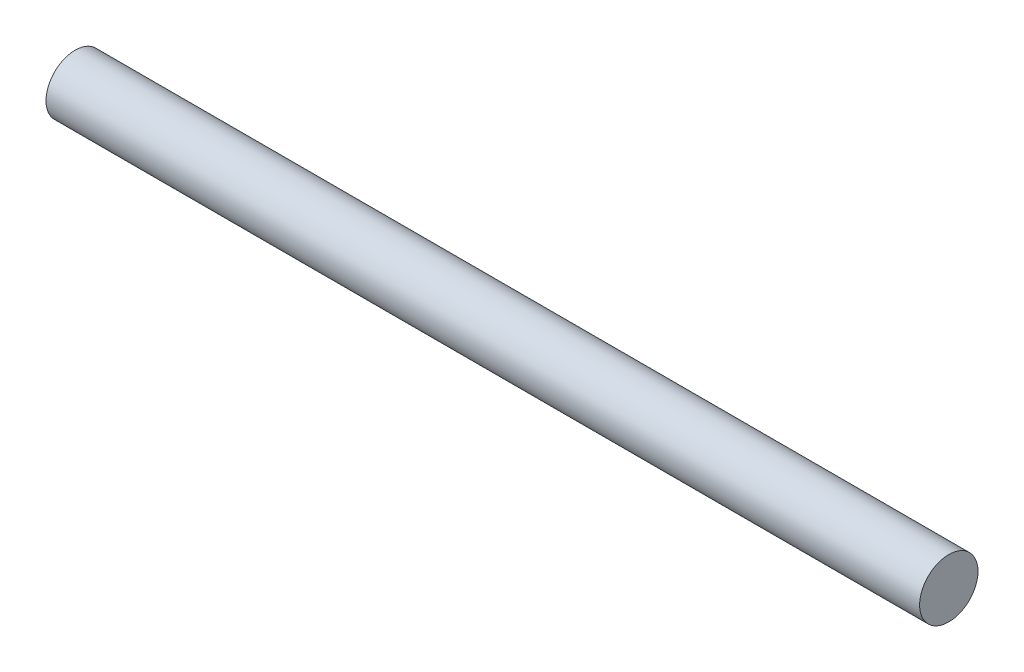
ISO-10303-21;
HEADER;
FILE_DESCRIPTION(('STEP AP214'),'2;1');
FILE_NAME('part.step','',(''),(''),'','','');
FILE_SCHEMA(('AUTOMOTIVE_DESIGN { 1 0 10303 214 1 1 1 1 }'));
ENDSEC;
DATA;
#1=APPLICATION_CONTEXT('core data for automotive mechanical design processes');
#2=APPLICATION_PROTOCOL_DEFINITION('international standard','automotive_design',2000,#1);
#3=PRODUCT_CONTEXT('',#1,'mechanical');
#4=PRODUCT('Part','Part','',(#3));
#5=PRODUCT_RELATED_PRODUCT_CATEGORY('part','',(#4));
#6=PRODUCT_DEFINITION_FORMATION('','',#4);
#7=PRODUCT_DEFINITION_CONTEXT('part definition',#1,'design');
#8=PRODUCT_DEFINITION('design','',#6,#7);
#9=PRODUCT_DEFINITION_SHAPE('','',#8);
#10=(LENGTH_UNIT() NAMED_UNIT(*) SI_UNIT(.MILLI.,.METRE.));
#11=(NAMED_UNIT(*) PLANE_ANGLE_UNIT() SI_UNIT($,.RADIAN.));
#12=(NAMED_UNIT(*) SI_UNIT($,.STERADIAN.) SOLID_ANGLE_UNIT());
#13=UNCERTAINTY_MEASURE_WITH_UNIT(LENGTH_MEASURE(1.E-05),#10,'distance_accuracy_value','');
#14=(GEOMETRIC_REPRESENTATION_CONTEXT(3) GLOBAL_UNCERTAINTY_ASSIGNED_CONTEXT((#13)) GLOBAL_UNIT_ASSIGNED_CONTEXT((#10,
#11,#12)) REPRESENTATION_CONTEXT('',''));
#15=CARTESIAN_POINT('',(0.,0.,0.));
#16=DIRECTION('',(0.,0.,1.));
#17=DIRECTION('',(1.,0.,0.));
#18=AXIS2_PLACEMENT_3D('',#15,#16,#17);
#19=CARTESIAN_POINT('',(-175.,0.,0.));
#20=DIRECTION('',(1.,0.,0.));
#21=DIRECTION('',(0.,0.,-1.));
#22=AXIS2_PLACEMENT_3D('',#19,#20,#21);
#23=CYLINDRICAL_SURFACE('',#22,12.7);
#24=CARTESIAN_POINT('',(190.,0.,0.));
#25=DIRECTION('',(1.,0.,0.));
#26=DIRECTION('',(0.,0.,-1.));
#27=AXIS2_PLACEMENT_3D('',#24,#25,#26);
#28=CIRCLE('',#27,12.7);
#29=CARTESIAN_POINT('',(190.,0.,-12.7));
#30=VERTEX_POINT('',#29);
#31=EDGE_CURVE('E10',#30,#30,#28,.T.);
#32=ORIENTED_EDGE('',*,*,#31,.F.);
#33=EDGE_LOOP('',(#32));
#34=FACE_BOUND('',#33,.T.);
#35=CARTESIAN_POINT('',(-190.,0.,0.));
#36=DIRECTION('',(-1.,0.,0.));
#37=DIRECTION('',(0.,0.,1.));
#38=AXIS2_PLACEMENT_3D('',#35,#36,#37);
#39=CIRCLE('',#38,12.7);
#40=CARTESIAN_POINT('',(-190.,0.,12.7));
#41=VERTEX_POINT('',#40);
#42=EDGE_CURVE('E45',#41,#41,#39,.T.);
#43=ORIENTED_EDGE('',*,*,#42,.F.);
#44=EDGE_LOOP('',(#43));
#45=FACE_BOUND('',#44,.T.);
#46=ADVANCED_FACE('F39',(#34,#45),#23,.T.);
#47=CARTESIAN_POINT('',(190.,0.,0.));
#48=DIRECTION('',(1.,0.,0.));
#49=DIRECTION('',(0.,0.,-1.));
#50=AXIS2_PLACEMENT_3D('',#47,#48,#49);
#51=PLANE('',#50);
#52=ORIENTED_EDGE('',*,*,#31,.T.);
#53=EDGE_LOOP('',(#52));
#54=FACE_BOUND('',#53,.T.);
#55=ADVANCED_FACE('F54',(#54),#51,.T.);
#56=CARTESIAN_POINT('',(-190.,0.,0.));
#57=DIRECTION('',(-1.,0.,0.));
#58=DIRECTION('',(0.,0.,1.));
#59=AXIS2_PLACEMENT_3D('',#56,#57,#58);
#60=PLANE('',#59);
#61=ORIENTED_EDGE('',*,*,#42,.T.);
#62=EDGE_LOOP('',(#61));
#63=FACE_BOUND('',#62,.T.);
#64=ADVANCED_FACE('F51',(#63),#60,.T.);
#65=CLOSED_SHELL('',(#46,#55,#64));
#66=MANIFOLD_SOLID_BREP('B2',#65);
#67=ADVANCED_BREP_SHAPE_REPRESENTATION('',(#18,#66),#14);
#68=SHAPE_DEFINITION_REPRESENTATION(#9,#67);
ENDSEC;
END-ISO-10303-21;
